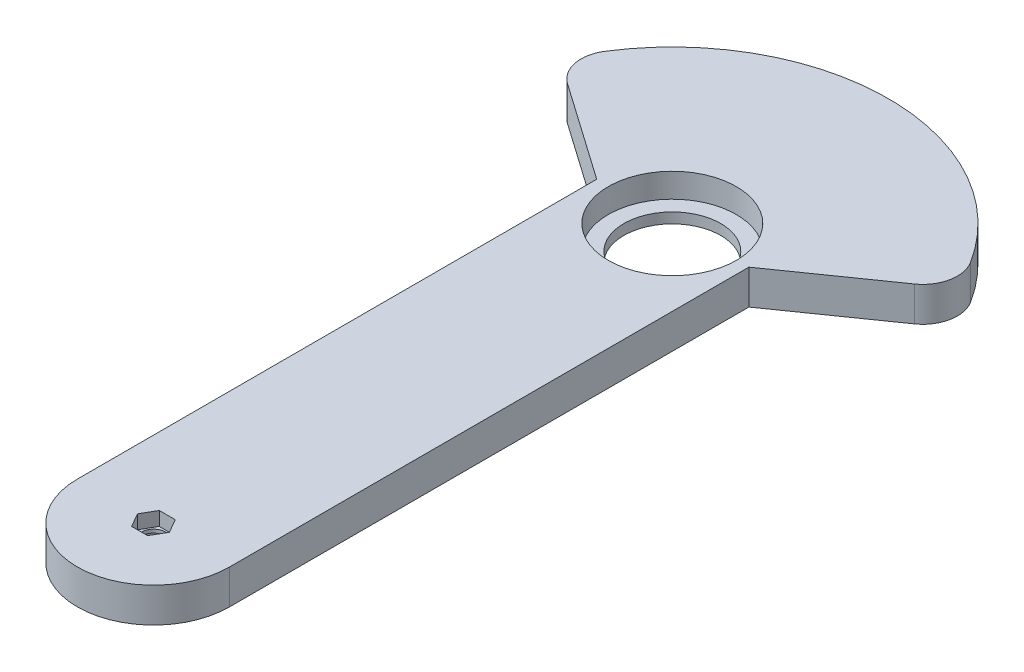
ISO-10303-21;
HEADER;
FILE_DESCRIPTION(('STEP AP214'),'2;1');
FILE_NAME('part.step','',(''),(''),'','','');
FILE_SCHEMA(('AUTOMOTIVE_DESIGN { 1 0 10303 214 1 1 1 1 }'));
ENDSEC;
DATA;
#1=APPLICATION_CONTEXT('core data for automotive mechanical design processes');
#2=APPLICATION_PROTOCOL_DEFINITION('international standard','automotive_design',2000,#1);
#3=PRODUCT_CONTEXT('',#1,'mechanical');
#4=PRODUCT('Part','Part','',(#3));
#5=PRODUCT_RELATED_PRODUCT_CATEGORY('part','',(#4));
#6=PRODUCT_DEFINITION_FORMATION('','',#4);
#7=PRODUCT_DEFINITION_CONTEXT('part definition',#1,'design');
#8=PRODUCT_DEFINITION('design','',#6,#7);
#9=PRODUCT_DEFINITION_SHAPE('','',#8);
#10=(LENGTH_UNIT() NAMED_UNIT(*) SI_UNIT(.MILLI.,.METRE.));
#11=(NAMED_UNIT(*) PLANE_ANGLE_UNIT() SI_UNIT($,.RADIAN.));
#12=(NAMED_UNIT(*) SI_UNIT($,.STERADIAN.) SOLID_ANGLE_UNIT());
#13=UNCERTAINTY_MEASURE_WITH_UNIT(LENGTH_MEASURE(1.E-05),#10,'distance_accuracy_value','');
#14=(GEOMETRIC_REPRESENTATION_CONTEXT(3) GLOBAL_UNCERTAINTY_ASSIGNED_CONTEXT((#13)) GLOBAL_UNIT_ASSIGNED_CONTEXT((#10,
#11,#12)) REPRESENTATION_CONTEXT('',''));
#15=CARTESIAN_POINT('',(0.,0.,0.));
#16=DIRECTION('',(0.,0.,1.));
#17=DIRECTION('',(1.,0.,0.));
#18=AXIS2_PLACEMENT_3D('',#15,#16,#17);
#19=CARTESIAN_POINT('',(0.,0.,150.));
#20=DIRECTION('',(0.,1.,0.));
#21=DIRECTION('',(0.,0.,1.));
#22=AXIS2_PLACEMENT_3D('',#19,#20,#21);
#23=CYLINDRICAL_SURFACE('',#22,3.5);
#24=CARTESIAN_POINT('',(0.,5.,150.));
#25=DIRECTION('',(0.,-1.,0.));
#26=DIRECTION('',(0.,0.,-1.));
#27=AXIS2_PLACEMENT_3D('',#24,#25,#26);
#28=CIRCLE('',#27,3.5);
#29=CARTESIAN_POINT('',(0.,5.,146.5));
#30=VERTEX_POINT('',#29);
#31=EDGE_CURVE('E194',#30,#30,#28,.F.);
#32=ORIENTED_EDGE('',*,*,#31,.F.);
#33=EDGE_LOOP('',(#32));
#34=FACE_BOUND('',#33,.T.);
#35=CARTESIAN_POINT('',(0.,6.,150.));
#36=DIRECTION('',(0.,1.,0.));
#37=DIRECTION('',(0.,0.,1.));
#38=AXIS2_PLACEMENT_3D('',#35,#36,#37);
#39=CIRCLE('',#38,3.5);
#40=CARTESIAN_POINT('',(0.,6.,153.5));
#41=VERTEX_POINT('',#40);
#42=EDGE_CURVE('E38',#41,#41,#39,.F.);
#43=ORIENTED_EDGE('',*,*,#42,.F.);
#44=EDGE_LOOP('',(#43));
#45=FACE_BOUND('',#44,.T.);
#46=ADVANCED_FACE('F34',(#34,#45),#23,.F.);
#47=CARTESIAN_POINT('',(-50.1264010567363,10.,-19.8392015237314));
#48=DIRECTION('',(0.573576436351041,0.,-0.819152044288995));
#49=DIRECTION('',(-0.819152044288995,0.,-0.573576436351041));
#50=AXIS2_PLACEMENT_3D('',#47,#48,#49);
#51=PLANE('',#50);
#52=DIRECTION('',(0.,-1.,0.));
#53=VECTOR('',#52,1.);
#54=CARTESIAN_POINT('',(-22.,10.,-0.144883481095287));
#55=LINE('',#54,#53);
#56=CARTESIAN_POINT('',(-22.,10.,-0.144883481095291));
#57=VERTEX_POINT('',#56);
#58=CARTESIAN_POINT('',(-22.,0.,-0.144883481095291));
#59=VERTEX_POINT('',#58);
#60=EDGE_CURVE('E229',#57,#59,#55,.T.);
#61=ORIENTED_EDGE('',*,*,#60,.F.);
#62=DIRECTION('',(0.819152044288995,0.,0.573576436351041));
#63=VECTOR('',#62,1.);
#64=CARTESIAN_POINT('',(-50.1264010567363,10.,-19.8392015237314));
#65=LINE('',#64,#63);
#66=CARTESIAN_POINT('',(-50.1264010567363,10.,-19.8392015237314));
#67=VERTEX_POINT('',#66);
#68=EDGE_CURVE('E242',#67,#57,#65,.T.);
#69=ORIENTED_EDGE('',*,*,#68,.F.);
#70=DIRECTION('',(0.,-1.,0.));
#71=VECTOR('',#70,1.);
#72=CARTESIAN_POINT('',(-50.1264010567363,10.,-19.8392015237314));
#73=LINE('',#72,#71);
#74=CARTESIAN_POINT('',(-50.1264010567363,0.,-19.8392015237314));
#75=VERTEX_POINT('',#74);
#76=EDGE_CURVE('E11',#67,#75,#73,.T.);
#77=ORIENTED_EDGE('',*,*,#76,.T.);
#78=DIRECTION('',(0.819152044288995,0.,0.573576436351041));
#79=VECTOR('',#78,1.);
#80=CARTESIAN_POINT('',(-50.1264010567363,0.,-19.8392015237314));
#81=LINE('',#80,#79);
#82=EDGE_CURVE('E237',#75,#59,#81,.T.);
#83=ORIENTED_EDGE('',*,*,#82,.T.);
#84=EDGE_LOOP('',(#61,#69,#77,#83));
#85=FACE_BOUND('',#84,.T.);
#86=ADVANCED_FACE('F270',(#85),#51,.F.);
#87=CARTESIAN_POINT('',(50.1264010567363,10.,-19.8392015237314));
#88=DIRECTION('',(0.573576436351041,0.,0.819152044288995));
#89=DIRECTION('',(0.819152044288995,0.,-0.573576436351041));
#90=AXIS2_PLACEMENT_3D('',#87,#88,#89);
#91=PLANE('',#90);
#92=DIRECTION('',(-0.819152044288995,0.,0.573576436351041));
#93=VECTOR('',#92,1.);
#94=CARTESIAN_POINT('',(50.1264010567363,10.,-19.8392015237314));
#95=LINE('',#94,#93);
#96=CARTESIAN_POINT('',(50.1264010567363,10.,-19.8392015237314));
#97=VERTEX_POINT('',#96);
#98=CARTESIAN_POINT('',(22.,10.,-0.144883481095291));
#99=VERTEX_POINT('',#98);
#100=EDGE_CURVE('E59',#97,#99,#95,.T.);
#101=ORIENTED_EDGE('',*,*,#100,.T.);
#102=DIRECTION('',(0.,-1.,0.));
#103=VECTOR('',#102,1.);
#104=CARTESIAN_POINT('',(22.,10.,-0.144883481095292));
#105=LINE('',#104,#103);
#106=CARTESIAN_POINT('',(22.,0.,-0.144883481095291));
#107=VERTEX_POINT('',#106);
#108=EDGE_CURVE('E216',#99,#107,#105,.T.);
#109=ORIENTED_EDGE('',*,*,#108,.T.);
#110=DIRECTION('',(-0.819152044288995,0.,0.573576436351041));
#111=VECTOR('',#110,1.);
#112=CARTESIAN_POINT('',(50.1264010567363,0.,-19.8392015237314));
#113=LINE('',#112,#111);
#114=CARTESIAN_POINT('',(50.1264010567363,0.,-19.8392015237314));
#115=VERTEX_POINT('',#114);
#116=EDGE_CURVE('E253',#115,#107,#113,.T.);
#117=ORIENTED_EDGE('',*,*,#116,.F.);
#118=DIRECTION('',(0.,-1.,0.));
#119=VECTOR('',#118,1.);
#120=CARTESIAN_POINT('',(50.1264010567363,10.,-19.8392015237314));
#121=LINE('',#120,#119);
#122=EDGE_CURVE('E43',#97,#115,#121,.T.);
#123=ORIENTED_EDGE('',*,*,#122,.F.);
#124=EDGE_LOOP('',(#101,#109,#117,#123));
#125=FACE_BOUND('',#124,.T.);
#126=ADVANCED_FACE('F341',(#125),#91,.T.);
#127=CARTESIAN_POINT('',(-44.3906366932259,10.,-28.0307219666213));
#128=DIRECTION('',(0.,-1.,0.));
#129=DIRECTION('',(0.,0.,-1.));
#130=AXIS2_PLACEMENT_3D('',#127,#128,#129);
#131=CYLINDRICAL_SURFACE('',#130,10.);
#132=CARTESIAN_POINT('',(-44.3906366932259,0.,-28.0307219666213));
#133=DIRECTION('',(0.,-1.,0.));
#134=DIRECTION('',(0.,0.,-1.));
#135=AXIS2_PLACEMENT_3D('',#132,#133,#134);
#136=CIRCLE('',#135,10.);
#137=CARTESIAN_POINT('',(-52.8459960633642,0.,-33.3699071031206));
#138=VERTEX_POINT('',#137);
#139=EDGE_CURVE('E232',#75,#138,#136,.T.);
#140=ORIENTED_EDGE('',*,*,#139,.F.);
#141=ORIENTED_EDGE('',*,*,#76,.F.);
#142=CARTESIAN_POINT('',(-44.3906366932259,10.,-28.0307219666213));
#143=DIRECTION('',(0.,-1.,0.));
#144=DIRECTION('',(0.,0.,-1.));
#145=AXIS2_PLACEMENT_3D('',#142,#143,#144);
#146=CIRCLE('',#145,10.);
#147=CARTESIAN_POINT('',(-52.8459960633642,10.,-33.3699071031206));
#148=VERTEX_POINT('',#147);
#149=EDGE_CURVE('E233',#67,#148,#146,.T.);
#150=ORIENTED_EDGE('',*,*,#149,.T.);
#151=DIRECTION('',(0.,-1.,0.));
#152=VECTOR('',#151,1.);
#153=CARTESIAN_POINT('',(-52.8459960633642,10.,-33.3699071031206));
#154=LINE('',#153,#152);
#155=EDGE_CURVE('E245',#148,#138,#154,.T.);
#156=ORIENTED_EDGE('',*,*,#155,.T.);
#157=EDGE_LOOP('',(#140,#141,#150,#156));
#158=FACE_BOUND('',#157,.T.);
#159=ADVANCED_FACE('F36',(#158),#131,.T.);
#160=CARTESIAN_POINT('',(44.3906366932259,10.,-28.0307219666213));
#161=DIRECTION('',(0.,-1.,0.));
#162=DIRECTION('',(0.,0.,-1.));
#163=AXIS2_PLACEMENT_3D('',#160,#161,#162);
#164=CYLINDRICAL_SURFACE('',#163,10.);
#165=CARTESIAN_POINT('',(44.3906366932259,0.,-28.0307219666213));
#166=DIRECTION('',(0.,1.,0.));
#167=DIRECTION('',(0.,0.,1.));
#168=AXIS2_PLACEMENT_3D('',#165,#166,#167);
#169=CIRCLE('',#168,10.);
#170=CARTESIAN_POINT('',(52.8459960633642,0.,-33.3699071031206));
#171=VERTEX_POINT('',#170);
#172=EDGE_CURVE('E251',#115,#171,#169,.T.);
#173=ORIENTED_EDGE('',*,*,#172,.T.);
#174=DIRECTION('',(0.,-1.,0.));
#175=VECTOR('',#174,1.);
#176=CARTESIAN_POINT('',(52.8459960633642,10.,-33.3699071031206));
#177=LINE('',#176,#175);
#178=CARTESIAN_POINT('',(52.8459960633642,10.,-33.3699071031206));
#179=VERTEX_POINT('',#178);
#180=EDGE_CURVE('E258',#179,#171,#177,.T.);
#181=ORIENTED_EDGE('',*,*,#180,.F.);
#182=CARTESIAN_POINT('',(44.3906366932259,10.,-28.0307219666213));
#183=DIRECTION('',(0.,1.,0.));
#184=DIRECTION('',(0.,0.,1.));
#185=AXIS2_PLACEMENT_3D('',#182,#183,#184);
#186=CIRCLE('',#185,10.);
#187=EDGE_CURVE('E239',#97,#179,#186,.T.);
#188=ORIENTED_EDGE('',*,*,#187,.F.);
#189=ORIENTED_EDGE('',*,*,#122,.T.);
#190=EDGE_LOOP('',(#173,#181,#188,#189));
#191=FACE_BOUND('',#190,.T.);
#192=ADVANCED_FACE('F345',(#191),#164,.T.);
#193=CARTESIAN_POINT('',(0.,10.,0.));
#194=DIRECTION('',(0.,-1.,0.));
#195=DIRECTION('',(0.,0.,-1.));
#196=AXIS2_PLACEMENT_3D('',#193,#194,#195);
#197=CYLINDRICAL_SURFACE('',#196,62.5);
#198=CARTESIAN_POINT('',(0.,0.,0.));
#199=DIRECTION('',(0.,1.,0.));
#200=DIRECTION('',(0.,0.,1.));
#201=AXIS2_PLACEMENT_3D('',#198,#199,#200);
#202=CIRCLE('',#201,62.5);
#203=EDGE_CURVE('E248',#171,#138,#202,.T.);
#204=ORIENTED_EDGE('',*,*,#203,.T.);
#205=ORIENTED_EDGE('',*,*,#155,.F.);
#206=CARTESIAN_POINT('',(0.,10.,0.));
#207=DIRECTION('',(0.,1.,0.));
#208=DIRECTION('',(0.,0.,1.));
#209=AXIS2_PLACEMENT_3D('',#206,#207,#208);
#210=CIRCLE('',#209,62.5);
#211=EDGE_CURVE('E236',#179,#148,#210,.T.);
#212=ORIENTED_EDGE('',*,*,#211,.F.);
#213=ORIENTED_EDGE('',*,*,#180,.T.);
#214=EDGE_LOOP('',(#204,#205,#212,#213));
#215=FACE_BOUND('',#214,.T.);
#216=ADVANCED_FACE('F334',(#215),#197,.T.);
#217=CARTESIAN_POINT('',(-44.3906366932259,10.,-28.0307219666213));
#218=DIRECTION('',(0.,-1.,0.));
#219=DIRECTION('',(0.,0.,-1.));
#220=AXIS2_PLACEMENT_3D('',#217,#218,#219);
#221=PLANE('',#220);
#222=DIRECTION('',(-0.5,0.,-0.866025403784438));
#223=VECTOR('',#222,1.);
#224=CARTESIAN_POINT('',(4.61880215351702,10.,150.));
#225=LINE('',#224,#223);
#226=CARTESIAN_POINT('',(4.61880215351701,10.,150.));
#227=VERTEX_POINT('',#226);
#228=CARTESIAN_POINT('',(2.30940107675851,10.,146.));
#229=VERTEX_POINT('',#228);
#230=EDGE_CURVE('E172',#227,#229,#225,.T.);
#231=ORIENTED_EDGE('',*,*,#230,.F.);
#232=DIRECTION('',(0.499999999999999,0.,-0.866025403784439));
#233=VECTOR('',#232,1.);
#234=CARTESIAN_POINT('',(2.3094010767585,10.,154.));
#235=LINE('',#234,#233);
#236=CARTESIAN_POINT('',(2.3094010767585,10.,154.));
#237=VERTEX_POINT('',#236);
#238=EDGE_CURVE('E51',#237,#227,#235,.T.);
#239=ORIENTED_EDGE('',*,*,#238,.F.);
#240=DIRECTION('',(1.,0.,0.));
#241=VECTOR('',#240,1.);
#242=CARTESIAN_POINT('',(-2.30940107675852,10.,154.));
#243=LINE('',#242,#241);
#244=CARTESIAN_POINT('',(-2.30940107675852,10.,154.));
#245=VERTEX_POINT('',#244);
#246=EDGE_CURVE('E158',#245,#237,#243,.T.);
#247=ORIENTED_EDGE('',*,*,#246,.F.);
#248=DIRECTION('',(0.500000000000001,0.,0.866025403784438));
#249=VECTOR('',#248,1.);
#250=CARTESIAN_POINT('',(-4.61880215351703,10.,150.));
#251=LINE('',#250,#249);
#252=CARTESIAN_POINT('',(-4.61880215351703,10.,150.));
#253=VERTEX_POINT('',#252);
#254=EDGE_CURVE('E161',#253,#245,#251,.T.);
#255=ORIENTED_EDGE('',*,*,#254,.F.);
#256=DIRECTION('',(-0.499999999999999,0.,0.86602540378444));
#257=VECTOR('',#256,1.);
#258=CARTESIAN_POINT('',(-2.30940107675851,10.,146.));
#259=LINE('',#258,#257);
#260=CARTESIAN_POINT('',(-2.30940107675851,10.,146.));
#261=VERTEX_POINT('',#260);
#262=EDGE_CURVE('E177',#261,#253,#259,.T.);
#263=ORIENTED_EDGE('',*,*,#262,.F.);
#264=DIRECTION('',(-1.,0.,0.));
#265=VECTOR('',#264,1.);
#266=CARTESIAN_POINT('',(2.30940107675851,10.,146.));
#267=LINE('',#266,#265);
#268=EDGE_CURVE('E174',#229,#261,#267,.T.);
#269=ORIENTED_EDGE('',*,*,#268,.F.);
#270=EDGE_LOOP('',(#231,#239,#247,#255,#263,#269));
#271=FACE_BOUND('',#270,.T.);
#272=CARTESIAN_POINT('',(0.,10.,0.));
#273=DIRECTION('',(0.,1.,0.));
#274=DIRECTION('',(0.,0.,1.));
#275=AXIS2_PLACEMENT_3D('',#272,#273,#274);
#276=CIRCLE('',#275,18.5);
#277=CARTESIAN_POINT('',(0.,10.,18.5));
#278=VERTEX_POINT('',#277);
#279=EDGE_CURVE('E206',#278,#278,#276,.T.);
#280=ORIENTED_EDGE('',*,*,#279,.F.);
#281=EDGE_LOOP('',(#280));
#282=FACE_BOUND('',#281,.T.);
#283=ORIENTED_EDGE('',*,*,#68,.T.);
#284=DIRECTION('',(0.,0.,1.));
#285=VECTOR('',#284,1.);
#286=CARTESIAN_POINT('',(-22.,10.,-0.144883481095287));
#287=LINE('',#286,#285);
#288=CARTESIAN_POINT('',(-22.,10.,150.));
#289=VERTEX_POINT('',#288);
#290=EDGE_CURVE('E209',#57,#289,#287,.T.);
#291=ORIENTED_EDGE('',*,*,#290,.T.);
#292=CARTESIAN_POINT('',(0.,10.,150.));
#293=DIRECTION('',(0.,1.,0.));
#294=DIRECTION('',(0.,0.,1.));
#295=AXIS2_PLACEMENT_3D('',#292,#293,#294);
#296=CIRCLE('',#295,22.);
#297=CARTESIAN_POINT('',(22.,10.,150.));
#298=VERTEX_POINT('',#297);
#299=EDGE_CURVE('E211',#289,#298,#296,.T.);
#300=ORIENTED_EDGE('',*,*,#299,.T.);
#301=DIRECTION('',(0.,0.,-1.));
#302=VECTOR('',#301,1.);
#303=CARTESIAN_POINT('',(22.,10.,-0.144883481095292));
#304=LINE('',#303,#302);
#305=EDGE_CURVE('E214',#298,#99,#304,.T.);
#306=ORIENTED_EDGE('',*,*,#305,.T.);
#307=ORIENTED_EDGE('',*,*,#100,.F.);
#308=ORIENTED_EDGE('',*,*,#187,.T.);
#309=ORIENTED_EDGE('',*,*,#211,.T.);
#310=ORIENTED_EDGE('',*,*,#149,.F.);
#311=EDGE_LOOP('',(#283,#291,#300,#306,#307,#308,#309,#310));
#312=FACE_BOUND('',#311,.T.);
#313=ADVANCED_FACE('F331',(#271,#282,#312),#221,.F.);
#314=CARTESIAN_POINT('',(-44.3906366932259,0.,-28.0307219666213));
#315=DIRECTION('',(0.,-1.,0.));
#316=DIRECTION('',(0.,0.,-1.));
#317=AXIS2_PLACEMENT_3D('',#314,#315,#316);
#318=PLANE('',#317);
#319=CARTESIAN_POINT('',(0.,0.,150.));
#320=DIRECTION('',(0.,-1.,0.));
#321=DIRECTION('',(0.,0.,-1.));
#322=AXIS2_PLACEMENT_3D('',#319,#320,#321);
#323=CIRCLE('',#322,8.);
#324=CARTESIAN_POINT('',(0.,0.,142.));
#325=VERTEX_POINT('',#324);
#326=EDGE_CURVE('E195',#325,#325,#323,.T.);
#327=ORIENTED_EDGE('',*,*,#326,.F.);
#328=EDGE_LOOP('',(#327));
#329=FACE_BOUND('',#328,.T.);
#330=CARTESIAN_POINT('',(0.,0.,0.));
#331=DIRECTION('',(0.,1.,0.));
#332=DIRECTION('',(0.,0.,1.));
#333=AXIS2_PLACEMENT_3D('',#330,#331,#332);
#334=CIRCLE('',#333,14.);
#335=CARTESIAN_POINT('',(0.,0.,14.));
#336=VERTEX_POINT('',#335);
#337=EDGE_CURVE('E198',#336,#336,#334,.T.);
#338=ORIENTED_EDGE('',*,*,#337,.T.);
#339=EDGE_LOOP('',(#338));
#340=FACE_BOUND('',#339,.T.);
#341=DIRECTION('',(0.,0.,1.));
#342=VECTOR('',#341,1.);
#343=CARTESIAN_POINT('',(-22.,0.,-0.144883481095287));
#344=LINE('',#343,#342);
#345=CARTESIAN_POINT('',(-22.,0.,150.));
#346=VERTEX_POINT('',#345);
#347=EDGE_CURVE('E205',#59,#346,#344,.T.);
#348=ORIENTED_EDGE('',*,*,#347,.F.);
#349=ORIENTED_EDGE('',*,*,#82,.F.);
#350=ORIENTED_EDGE('',*,*,#139,.T.);
#351=ORIENTED_EDGE('',*,*,#203,.F.);
#352=ORIENTED_EDGE('',*,*,#172,.F.);
#353=ORIENTED_EDGE('',*,*,#116,.T.);
#354=DIRECTION('',(0.,0.,-1.));
#355=VECTOR('',#354,1.);
#356=CARTESIAN_POINT('',(22.,0.,-0.144883481095292));
#357=LINE('',#356,#355);
#358=CARTESIAN_POINT('',(22.,0.,150.));
#359=VERTEX_POINT('',#358);
#360=EDGE_CURVE('E212',#359,#107,#357,.T.);
#361=ORIENTED_EDGE('',*,*,#360,.F.);
#362=CARTESIAN_POINT('',(0.,0.,150.));
#363=DIRECTION('',(0.,1.,0.));
#364=DIRECTION('',(0.,0.,1.));
#365=AXIS2_PLACEMENT_3D('',#362,#363,#364);
#366=CIRCLE('',#365,22.);
#367=EDGE_CURVE('E218',#346,#359,#366,.T.);
#368=ORIENTED_EDGE('',*,*,#367,.F.);
#369=EDGE_LOOP('',(#348,#349,#350,#351,#352,#353,#361,#368));
#370=FACE_BOUND('',#369,.T.);
#371=ADVANCED_FACE('F329',(#329,#340,#370),#318,.T.);
#372=CARTESIAN_POINT('',(-22.,10.,-0.144883481095287));
#373=DIRECTION('',(1.,0.,0.));
#374=DIRECTION('',(0.,0.,-1.));
#375=AXIS2_PLACEMENT_3D('',#372,#373,#374);
#376=PLANE('',#375);
#377=ORIENTED_EDGE('',*,*,#347,.T.);
#378=DIRECTION('',(0.,-1.,0.));
#379=VECTOR('',#378,1.);
#380=CARTESIAN_POINT('',(-22.,10.,150.));
#381=LINE('',#380,#379);
#382=EDGE_CURVE('E226',#289,#346,#381,.T.);
#383=ORIENTED_EDGE('',*,*,#382,.F.);
#384=ORIENTED_EDGE('',*,*,#290,.F.);
#385=ORIENTED_EDGE('',*,*,#60,.T.);
#386=EDGE_LOOP('',(#377,#383,#384,#385));
#387=FACE_BOUND('',#386,.T.);
#388=ADVANCED_FACE('F325',(#387),#376,.F.);
#389=CARTESIAN_POINT('',(0.,10.,150.));
#390=DIRECTION('',(0.,-1.,0.));
#391=DIRECTION('',(0.,0.,-1.));
#392=AXIS2_PLACEMENT_3D('',#389,#390,#391);
#393=CYLINDRICAL_SURFACE('',#392,22.);
#394=ORIENTED_EDGE('',*,*,#367,.T.);
#395=DIRECTION('',(0.,-1.,0.));
#396=VECTOR('',#395,1.);
#397=CARTESIAN_POINT('',(22.,10.,150.));
#398=LINE('',#397,#396);
#399=EDGE_CURVE('E223',#298,#359,#398,.T.);
#400=ORIENTED_EDGE('',*,*,#399,.F.);
#401=ORIENTED_EDGE('',*,*,#299,.F.);
#402=ORIENTED_EDGE('',*,*,#382,.T.);
#403=EDGE_LOOP('',(#394,#400,#401,#402));
#404=FACE_BOUND('',#403,.T.);
#405=ADVANCED_FACE('F321',(#404),#393,.T.);
#406=CARTESIAN_POINT('',(22.,10.,-0.144883481095292));
#407=DIRECTION('',(-1.,0.,0.));
#408=DIRECTION('',(0.,0.,1.));
#409=AXIS2_PLACEMENT_3D('',#406,#407,#408);
#410=PLANE('',#409);
#411=ORIENTED_EDGE('',*,*,#360,.T.);
#412=ORIENTED_EDGE('',*,*,#108,.F.);
#413=ORIENTED_EDGE('',*,*,#305,.F.);
#414=ORIENTED_EDGE('',*,*,#399,.T.);
#415=EDGE_LOOP('',(#411,#412,#413,#414));
#416=FACE_BOUND('',#415,.T.);
#417=ADVANCED_FACE('F317',(#416),#410,.F.);
#418=CARTESIAN_POINT('',(0.,3.,0.));
#419=DIRECTION('',(0.,1.,0.));
#420=DIRECTION('',(0.,0.,1.));
#421=AXIS2_PLACEMENT_3D('',#418,#419,#420);
#422=CYLINDRICAL_SURFACE('',#421,18.5);
#423=CARTESIAN_POINT('',(0.,3.,0.));
#424=DIRECTION('',(0.,1.,0.));
#425=DIRECTION('',(0.,0.,1.));
#426=AXIS2_PLACEMENT_3D('',#423,#424,#425);
#427=CIRCLE('',#426,18.5);
#428=CARTESIAN_POINT('',(0.,3.,18.5));
#429=VERTEX_POINT('',#428);
#430=EDGE_CURVE('E202',#429,#429,#427,.T.);
#431=ORIENTED_EDGE('',*,*,#430,.F.);
#432=EDGE_LOOP('',(#431));
#433=FACE_BOUND('',#432,.T.);
#434=ORIENTED_EDGE('',*,*,#279,.T.);
#435=EDGE_LOOP('',(#434));
#436=FACE_BOUND('',#435,.T.);
#437=ADVANCED_FACE('F313',(#433,#436),#422,.F.);
#438=CARTESIAN_POINT('',(0.,3.,0.));
#439=DIRECTION('',(0.,1.,0.));
#440=DIRECTION('',(0.,0.,1.));
#441=AXIS2_PLACEMENT_3D('',#438,#439,#440);
#442=PLANE('',#441);
#443=CARTESIAN_POINT('',(0.,3.,0.));
#444=DIRECTION('',(0.,1.,0.));
#445=DIRECTION('',(0.,0.,1.));
#446=AXIS2_PLACEMENT_3D('',#443,#444,#445);
#447=CIRCLE('',#446,14.);
#448=CARTESIAN_POINT('',(0.,3.,14.));
#449=VERTEX_POINT('',#448);
#450=EDGE_CURVE('E201',#449,#449,#447,.T.);
#451=ORIENTED_EDGE('',*,*,#450,.F.);
#452=EDGE_LOOP('',(#451));
#453=FACE_BOUND('',#452,.T.);
#454=ORIENTED_EDGE('',*,*,#430,.T.);
#455=EDGE_LOOP('',(#454));
#456=FACE_BOUND('',#455,.T.);
#457=ADVANCED_FACE('F309',(#453,#456),#442,.T.);
#458=CARTESIAN_POINT('',(0.,0.,0.));
#459=DIRECTION('',(0.,1.,0.));
#460=DIRECTION('',(0.,0.,1.));
#461=AXIS2_PLACEMENT_3D('',#458,#459,#460);
#462=CYLINDRICAL_SURFACE('',#461,14.);
#463=ORIENTED_EDGE('',*,*,#450,.T.);
#464=EDGE_LOOP('',(#463));
#465=FACE_BOUND('',#464,.T.);
#466=ORIENTED_EDGE('',*,*,#337,.F.);
#467=EDGE_LOOP('',(#466));
#468=FACE_BOUND('',#467,.T.);
#469=ADVANCED_FACE('F304',(#465,#468),#462,.F.);
#470=CARTESIAN_POINT('',(0.,5.,150.));
#471=DIRECTION('',(0.,-1.,0.));
#472=DIRECTION('',(0.,0.,-1.));
#473=AXIS2_PLACEMENT_3D('',#470,#471,#472);
#474=PLANE('',#473);
#475=CARTESIAN_POINT('',(0.,5.,150.));
#476=DIRECTION('',(0.,-1.,0.));
#477=DIRECTION('',(0.,0.,-1.));
#478=AXIS2_PLACEMENT_3D('',#475,#476,#477);
#479=CIRCLE('',#478,8.);
#480=CARTESIAN_POINT('',(0.,5.,142.));
#481=VERTEX_POINT('',#480);
#482=EDGE_CURVE('E191',#481,#481,#479,.T.);
#483=ORIENTED_EDGE('',*,*,#482,.T.);
#484=EDGE_LOOP('',(#483));
#485=FACE_BOUND('',#484,.T.);
#486=ORIENTED_EDGE('',*,*,#31,.T.);
#487=EDGE_LOOP('',(#486));
#488=FACE_BOUND('',#487,.T.);
#489=ADVANCED_FACE('F266',(#485,#488),#474,.T.);
#490=CARTESIAN_POINT('',(0.,5.,150.));
#491=DIRECTION('',(0.,-1.,0.));
#492=DIRECTION('',(0.,0.,-1.));
#493=AXIS2_PLACEMENT_3D('',#490,#491,#492);
#494=CYLINDRICAL_SURFACE('',#493,8.);
#495=ORIENTED_EDGE('',*,*,#482,.F.);
#496=EDGE_LOOP('',(#495));
#497=FACE_BOUND('',#496,.T.);
#498=ORIENTED_EDGE('',*,*,#326,.T.);
#499=EDGE_LOOP('',(#498));
#500=FACE_BOUND('',#499,.T.);
#501=ADVANCED_FACE('F275',(#497,#500),#494,.F.);
#502=CARTESIAN_POINT('',(0.,6.,0.));
#503=DIRECTION('',(0.,1.,0.));
#504=DIRECTION('',(0.,0.,1.));
#505=AXIS2_PLACEMENT_3D('',#502,#503,#504);
#506=PLANE('',#505);
#507=DIRECTION('',(0.499999999999999,0.,-0.866025403784439));
#508=VECTOR('',#507,1.);
#509=CARTESIAN_POINT('',(2.3094010767585,6.,154.));
#510=LINE('',#509,#508);
#511=CARTESIAN_POINT('',(2.3094010767585,6.,154.));
#512=VERTEX_POINT('',#511);
#513=CARTESIAN_POINT('',(4.61880215351702,6.,150.));
#514=VERTEX_POINT('',#513);
#515=EDGE_CURVE('E138',#512,#514,#510,.T.);
#516=ORIENTED_EDGE('',*,*,#515,.T.);
#517=DIRECTION('',(-0.5,0.,-0.866025403784438));
#518=VECTOR('',#517,1.);
#519=CARTESIAN_POINT('',(4.61880215351702,6.,150.));
#520=LINE('',#519,#518);
#521=CARTESIAN_POINT('',(2.30940107675851,6.,146.));
#522=VERTEX_POINT('',#521);
#523=EDGE_CURVE('E147',#514,#522,#520,.T.);
#524=ORIENTED_EDGE('',*,*,#523,.T.);
#525=DIRECTION('',(-1.,0.,0.));
#526=VECTOR('',#525,1.);
#527=CARTESIAN_POINT('',(2.30940107675851,6.,146.));
#528=LINE('',#527,#526);
#529=CARTESIAN_POINT('',(-2.30940107675851,6.,146.));
#530=VERTEX_POINT('',#529);
#531=EDGE_CURVE('E152',#522,#530,#528,.T.);
#532=ORIENTED_EDGE('',*,*,#531,.T.);
#533=DIRECTION('',(-0.499999999999999,0.,0.86602540378444));
#534=VECTOR('',#533,1.);
#535=CARTESIAN_POINT('',(-2.30940107675851,6.,146.));
#536=LINE('',#535,#534);
#537=CARTESIAN_POINT('',(-4.61880215351703,6.,150.));
#538=VERTEX_POINT('',#537);
#539=EDGE_CURVE('E165',#530,#538,#536,.T.);
#540=ORIENTED_EDGE('',*,*,#539,.T.);
#541=DIRECTION('',(0.500000000000001,0.,0.866025403784438));
#542=VECTOR('',#541,1.);
#543=CARTESIAN_POINT('',(-4.61880215351703,6.,150.));
#544=LINE('',#543,#542);
#545=CARTESIAN_POINT('',(-2.30940107675852,6.,154.));
#546=VERTEX_POINT('',#545);
#547=EDGE_CURVE('E168',#538,#546,#544,.T.);
#548=ORIENTED_EDGE('',*,*,#547,.T.);
#549=DIRECTION('',(1.,0.,0.));
#550=VECTOR('',#549,1.);
#551=CARTESIAN_POINT('',(-2.30940107675852,6.,154.));
#552=LINE('',#551,#550);
#553=EDGE_CURVE('E144',#546,#512,#552,.T.);
#554=ORIENTED_EDGE('',*,*,#553,.T.);
#555=EDGE_LOOP('',(#516,#524,#532,#540,#548,#554));
#556=FACE_BOUND('',#555,.T.);
#557=ORIENTED_EDGE('',*,*,#42,.T.);
#558=EDGE_LOOP('',(#557));
#559=FACE_BOUND('',#558,.T.);
#560=ADVANCED_FACE('F154',(#556,#559),#506,.T.);
#561=CARTESIAN_POINT('',(2.3094010767585,6.,154.));
#562=DIRECTION('',(0.866025403784439,0.,0.499999999999999));
#563=DIRECTION('',(0.499999999999999,0.,-0.866025403784439));
#564=AXIS2_PLACEMENT_3D('',#561,#562,#563);
#565=PLANE('',#564);
#566=ORIENTED_EDGE('',*,*,#238,.T.);
#567=DIRECTION('',(0.,1.,0.));
#568=VECTOR('',#567,1.);
#569=CARTESIAN_POINT('',(4.61880215351702,6.,150.));
#570=LINE('',#569,#568);
#571=EDGE_CURVE('E134',#514,#227,#570,.T.);
#572=ORIENTED_EDGE('',*,*,#571,.F.);
#573=ORIENTED_EDGE('',*,*,#515,.F.);
#574=DIRECTION('',(0.,1.,0.));
#575=VECTOR('',#574,1.);
#576=CARTESIAN_POINT('',(2.3094010767585,6.,154.));
#577=LINE('',#576,#575);
#578=EDGE_CURVE('E182',#512,#237,#577,.T.);
#579=ORIENTED_EDGE('',*,*,#578,.T.);
#580=EDGE_LOOP('',(#566,#572,#573,#579));
#581=FACE_BOUND('',#580,.T.);
#582=ADVANCED_FACE('F136',(#581),#565,.F.);
#583=CARTESIAN_POINT('',(-2.30940107675852,6.,154.));
#584=DIRECTION('',(0.,0.,1.));
#585=DIRECTION('',(1.,0.,0.));
#586=AXIS2_PLACEMENT_3D('',#583,#584,#585);
#587=PLANE('',#586);
#588=ORIENTED_EDGE('',*,*,#246,.T.);
#589=ORIENTED_EDGE('',*,*,#578,.F.);
#590=ORIENTED_EDGE('',*,*,#553,.F.);
#591=DIRECTION('',(0.,1.,0.));
#592=VECTOR('',#591,1.);
#593=CARTESIAN_POINT('',(-2.30940107675852,6.,154.));
#594=LINE('',#593,#592);
#595=EDGE_CURVE('E184',#546,#245,#594,.T.);
#596=ORIENTED_EDGE('',*,*,#595,.T.);
#597=EDGE_LOOP('',(#588,#589,#590,#596));
#598=FACE_BOUND('',#597,.T.);
#599=ADVANCED_FACE('F281',(#598),#587,.F.);
#600=CARTESIAN_POINT('',(-4.61880215351703,6.,150.));
#601=DIRECTION('',(-0.866025403784438,0.,0.500000000000001));
#602=DIRECTION('',(0.500000000000001,0.,0.866025403784438));
#603=AXIS2_PLACEMENT_3D('',#600,#601,#602);
#604=PLANE('',#603);
#605=ORIENTED_EDGE('',*,*,#254,.T.);
#606=ORIENTED_EDGE('',*,*,#595,.F.);
#607=ORIENTED_EDGE('',*,*,#547,.F.);
#608=DIRECTION('',(0.,1.,0.));
#609=VECTOR('',#608,1.);
#610=CARTESIAN_POINT('',(-4.61880215351703,6.,150.));
#611=LINE('',#610,#609);
#612=EDGE_CURVE('E186',#538,#253,#611,.T.);
#613=ORIENTED_EDGE('',*,*,#612,.T.);
#614=EDGE_LOOP('',(#605,#606,#607,#613));
#615=FACE_BOUND('',#614,.T.);
#616=ADVANCED_FACE('F288',(#615),#604,.F.);
#617=CARTESIAN_POINT('',(-2.30940107675851,6.,146.));
#618=DIRECTION('',(-0.866025403784439,0.,-0.499999999999999));
#619=DIRECTION('',(-0.499999999999999,0.,0.86602540378444));
#620=AXIS2_PLACEMENT_3D('',#617,#618,#619);
#621=PLANE('',#620);
#622=ORIENTED_EDGE('',*,*,#262,.T.);
#623=ORIENTED_EDGE('',*,*,#612,.F.);
#624=ORIENTED_EDGE('',*,*,#539,.F.);
#625=DIRECTION('',(0.,1.,0.));
#626=VECTOR('',#625,1.);
#627=CARTESIAN_POINT('',(-2.30940107675851,6.,146.));
#628=LINE('',#627,#626);
#629=EDGE_CURVE('E188',#530,#261,#628,.T.);
#630=ORIENTED_EDGE('',*,*,#629,.T.);
#631=EDGE_LOOP('',(#622,#623,#624,#630));
#632=FACE_BOUND('',#631,.T.);
#633=ADVANCED_FACE('F292',(#632),#621,.F.);
#634=CARTESIAN_POINT('',(2.30940107675851,6.,146.));
#635=DIRECTION('',(0.,0.,-1.));
#636=DIRECTION('',(-1.,0.,0.));
#637=AXIS2_PLACEMENT_3D('',#634,#635,#636);
#638=PLANE('',#637);
#639=ORIENTED_EDGE('',*,*,#268,.T.);
#640=ORIENTED_EDGE('',*,*,#629,.F.);
#641=ORIENTED_EDGE('',*,*,#531,.F.);
#642=DIRECTION('',(0.,1.,0.));
#643=VECTOR('',#642,1.);
#644=CARTESIAN_POINT('',(2.30940107675851,6.,146.));
#645=LINE('',#644,#643);
#646=EDGE_CURVE('E143',#522,#229,#645,.T.);
#647=ORIENTED_EDGE('',*,*,#646,.T.);
#648=EDGE_LOOP('',(#639,#640,#641,#647));
#649=FACE_BOUND('',#648,.T.);
#650=ADVANCED_FACE('F296',(#649),#638,.F.);
#651=CARTESIAN_POINT('',(4.61880215351702,6.,150.));
#652=DIRECTION('',(0.866025403784438,0.,-0.500000000000001));
#653=DIRECTION('',(-0.500000000000001,0.,-0.866025403784438));
#654=AXIS2_PLACEMENT_3D('',#651,#652,#653);
#655=PLANE('',#654);
#656=ORIENTED_EDGE('',*,*,#230,.T.);
#657=ORIENTED_EDGE('',*,*,#646,.F.);
#658=ORIENTED_EDGE('',*,*,#523,.F.);
#659=ORIENTED_EDGE('',*,*,#571,.T.);
#660=EDGE_LOOP('',(#656,#657,#658,#659));
#661=FACE_BOUND('',#660,.T.);
#662=ADVANCED_FACE('F148',(#661),#655,.F.);
#663=CLOSED_SHELL('',(#46,#86,#126,#159,#192,#216,#313,#371,#388,#405,#417,#437,#457,#469,#489,
#501,#560,#582,#599,#616,#633,#650,#662));
#664=MANIFOLD_SOLID_BREP('B2',#663);
#665=ADVANCED_BREP_SHAPE_REPRESENTATION('',(#18,#664),#14);
#666=SHAPE_DEFINITION_REPRESENTATION(#9,#665);
ENDSEC;
END-ISO-10303-21;
